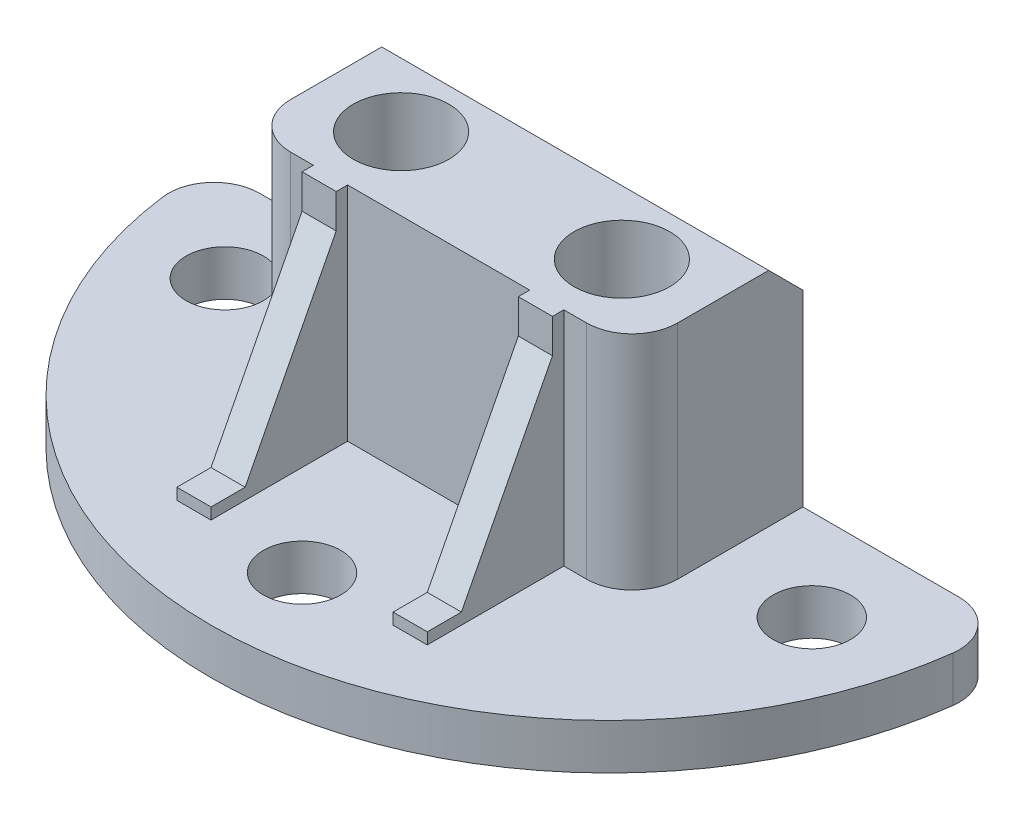
ISO-10303-21;
HEADER;
FILE_DESCRIPTION(('STEP AP214'),'2;1');
FILE_NAME('part.step','',(''),(''),'','','');
FILE_SCHEMA(('AUTOMOTIVE_DESIGN { 1 0 10303 214 1 1 1 1 }'));
ENDSEC;
DATA;
#1=APPLICATION_CONTEXT('core data for automotive mechanical design processes');
#2=APPLICATION_PROTOCOL_DEFINITION('international standard','automotive_design',2000,#1);
#3=PRODUCT_CONTEXT('',#1,'mechanical');
#4=PRODUCT('Part','Part','',(#3));
#5=PRODUCT_RELATED_PRODUCT_CATEGORY('part','',(#4));
#6=PRODUCT_DEFINITION_FORMATION('','',#4);
#7=PRODUCT_DEFINITION_CONTEXT('part definition',#1,'design');
#8=PRODUCT_DEFINITION('design','',#6,#7);
#9=PRODUCT_DEFINITION_SHAPE('','',#8);
#10=(LENGTH_UNIT() NAMED_UNIT(*) SI_UNIT(.MILLI.,.METRE.));
#11=(NAMED_UNIT(*) PLANE_ANGLE_UNIT() SI_UNIT($,.RADIAN.));
#12=(NAMED_UNIT(*) SI_UNIT($,.STERADIAN.) SOLID_ANGLE_UNIT());
#13=UNCERTAINTY_MEASURE_WITH_UNIT(LENGTH_MEASURE(1.E-05),#10,'distance_accuracy_value','');
#14=(GEOMETRIC_REPRESENTATION_CONTEXT(3) GLOBAL_UNCERTAINTY_ASSIGNED_CONTEXT((#13)) GLOBAL_UNIT_ASSIGNED_CONTEXT((#10,
#11,#12)) REPRESENTATION_CONTEXT('',''));
#15=CARTESIAN_POINT('',(0.,0.,0.));
#16=DIRECTION('',(0.,0.,1.));
#17=DIRECTION('',(1.,0.,0.));
#18=AXIS2_PLACEMENT_3D('',#15,#16,#17);
#19=CARTESIAN_POINT('',(0.,11.75,0.));
#20=DIRECTION('',(0.,1.,0.));
#21=DIRECTION('',(0.,0.,1.));
#22=AXIS2_PLACEMENT_3D('',#19,#20,#21);
#23=PLANE('',#22);
#24=CARTESIAN_POINT('',(-4.85,11.75,4.3));
#25=DIRECTION('',(0.,1.,0.));
#26=DIRECTION('',(0.,0.,1.));
#27=AXIS2_PLACEMENT_3D('',#24,#25,#26);
#28=CIRCLE('',#27,2.1);
#29=CARTESIAN_POINT('',(-4.85,11.75,6.4));
#30=VERTEX_POINT('',#29);
#31=EDGE_CURVE('E875',#30,#30,#28,.T.);
#32=ORIENTED_EDGE('',*,*,#31,.F.);
#33=EDGE_LOOP('',(#32));
#34=FACE_BOUND('',#33,.T.);
#35=CARTESIAN_POINT('',(4.85,11.75,4.3));
#36=DIRECTION('',(0.,1.,0.));
#37=DIRECTION('',(0.,0.,1.));
#38=AXIS2_PLACEMENT_3D('',#35,#36,#37);
#39=CIRCLE('',#38,2.1);
#40=CARTESIAN_POINT('',(4.85,11.75,6.4));
#41=VERTEX_POINT('',#40);
#42=EDGE_CURVE('E878',#41,#41,#39,.T.);
#43=ORIENTED_EDGE('',*,*,#42,.F.);
#44=EDGE_LOOP('',(#43));
#45=FACE_BOUND('',#44,.T.);
#46=DIRECTION('',(0.,0.,-1.));
#47=VECTOR('',#46,1.);
#48=CARTESIAN_POINT('',(-5.5,11.75,13.5));
#49=LINE('',#48,#47);
#50=CARTESIAN_POINT('',(-5.5,11.75,8.));
#51=VERTEX_POINT('',#50);
#52=CARTESIAN_POINT('',(-5.5,11.75,7.5));
#53=VERTEX_POINT('',#52);
#54=EDGE_CURVE('E286',#51,#53,#49,.T.);
#55=ORIENTED_EDGE('',*,*,#54,.F.);
#56=DIRECTION('',(1.,0.,0.));
#57=VECTOR('',#56,1.);
#58=CARTESIAN_POINT('',(-17.3704261489394,11.75,8.));
#59=LINE('',#58,#57);
#60=CARTESIAN_POINT('',(-4.,11.75,8.));
#61=VERTEX_POINT('',#60);
#62=EDGE_CURVE('E235',#51,#61,#59,.T.);
#63=ORIENTED_EDGE('',*,*,#62,.T.);
#64=DIRECTION('',(0.,0.,-1.));
#65=VECTOR('',#64,1.);
#66=CARTESIAN_POINT('',(-4.,11.75,13.5));
#67=LINE('',#66,#65);
#68=CARTESIAN_POINT('',(-4.,11.75,7.5));
#69=VERTEX_POINT('',#68);
#70=EDGE_CURVE('E291',#61,#69,#67,.T.);
#71=ORIENTED_EDGE('',*,*,#70,.T.);
#72=DIRECTION('',(1.,0.,0.));
#73=VECTOR('',#72,1.);
#74=CARTESIAN_POINT('',(0.,11.75,7.5));
#75=LINE('',#74,#73);
#76=CARTESIAN_POINT('',(4.,11.75,7.5));
#77=VERTEX_POINT('',#76);
#78=EDGE_CURVE('E307',#69,#77,#75,.T.);
#79=ORIENTED_EDGE('',*,*,#78,.T.);
#80=DIRECTION('',(0.,0.,-1.));
#81=VECTOR('',#80,1.);
#82=CARTESIAN_POINT('',(4.,11.75,13.5));
#83=LINE('',#82,#81);
#84=CARTESIAN_POINT('',(4.,11.75,8.));
#85=VERTEX_POINT('',#84);
#86=EDGE_CURVE('E264',#85,#77,#83,.T.);
#87=ORIENTED_EDGE('',*,*,#86,.F.);
#88=CARTESIAN_POINT('',(5.5,11.75,8.));
#89=VERTEX_POINT('',#88);
#90=EDGE_CURVE('E236',#85,#89,#59,.T.);
#91=ORIENTED_EDGE('',*,*,#90,.T.);
#92=DIRECTION('',(0.,0.,-1.));
#93=VECTOR('',#92,1.);
#94=CARTESIAN_POINT('',(5.5,11.75,13.5));
#95=LINE('',#94,#93);
#96=CARTESIAN_POINT('',(5.5,11.75,7.5));
#97=VERTEX_POINT('',#96);
#98=EDGE_CURVE('E262',#89,#97,#95,.T.);
#99=ORIENTED_EDGE('',*,*,#98,.T.);
#100=CARTESIAN_POINT('',(6.5,11.75,7.5));
#101=VERTEX_POINT('',#100);
#102=EDGE_CURVE('E302',#97,#101,#75,.T.);
#103=ORIENTED_EDGE('',*,*,#102,.T.);
#104=CARTESIAN_POINT('',(6.5,11.75,5.5));
#105=DIRECTION('',(0.,1.,0.));
#106=DIRECTION('',(0.,0.,1.));
#107=AXIS2_PLACEMENT_3D('',#104,#105,#106);
#108=CIRCLE('',#107,2.);
#109=CARTESIAN_POINT('',(8.5,11.75,5.5));
#110=VERTEX_POINT('',#109);
#111=EDGE_CURVE('E380',#101,#110,#108,.T.);
#112=ORIENTED_EDGE('',*,*,#111,.T.);
#113=DIRECTION('',(0.,0.,1.));
#114=VECTOR('',#113,1.);
#115=CARTESIAN_POINT('',(8.5,11.75,0.));
#116=LINE('',#115,#114);
#117=CARTESIAN_POINT('',(8.5,11.75,1.5));
#118=VERTEX_POINT('',#117);
#119=EDGE_CURVE('E298',#118,#110,#116,.T.);
#120=ORIENTED_EDGE('',*,*,#119,.F.);
#121=DIRECTION('',(-1.,0.,0.));
#122=VECTOR('',#121,1.);
#123=CARTESIAN_POINT('',(0.,11.75,1.5));
#124=LINE('',#123,#122);
#125=CARTESIAN_POINT('',(-8.5,11.75,1.5));
#126=VERTEX_POINT('',#125);
#127=EDGE_CURVE('E398',#118,#126,#124,.T.);
#128=ORIENTED_EDGE('',*,*,#127,.T.);
#129=DIRECTION('',(0.,0.,1.));
#130=VECTOR('',#129,1.);
#131=CARTESIAN_POINT('',(-8.5,11.75,0.));
#132=LINE('',#131,#130);
#133=CARTESIAN_POINT('',(-8.5,11.75,5.5));
#134=VERTEX_POINT('',#133);
#135=EDGE_CURVE('E300',#126,#134,#132,.T.);
#136=ORIENTED_EDGE('',*,*,#135,.T.);
#137=CARTESIAN_POINT('',(-6.5,11.75,5.5));
#138=DIRECTION('',(0.,1.,0.));
#139=DIRECTION('',(0.,0.,1.));
#140=AXIS2_PLACEMENT_3D('',#137,#138,#139);
#141=CIRCLE('',#140,2.);
#142=CARTESIAN_POINT('',(-6.5,11.75,7.5));
#143=VERTEX_POINT('',#142);
#144=EDGE_CURVE('E383',#134,#143,#141,.T.);
#145=ORIENTED_EDGE('',*,*,#144,.T.);
#146=EDGE_CURVE('E303',#143,#53,#75,.T.);
#147=ORIENTED_EDGE('',*,*,#146,.T.);
#148=EDGE_LOOP('',(#55,#63,#71,#79,#87,#91,#99,#103,#112,#120,#128,#136,#145,#147));
#149=FACE_BOUND('',#148,.T.);
#150=ADVANCED_FACE('F39',(#34,#45,#149),#23,.T.);
#151=CARTESIAN_POINT('',(-5.5,11.75,13.5));
#152=DIRECTION('',(1.,0.,0.));
#153=DIRECTION('',(0.,1.,0.));
#154=AXIS2_PLACEMENT_3D('',#151,#152,#153);
#155=PLANE('',#154);
#156=DIRECTION('',(0.,0.,1.));
#157=VECTOR('',#156,1.);
#158=CARTESIAN_POINT('',(-5.5,2.5,13.5));
#159=LINE('',#158,#157);
#160=CARTESIAN_POINT('',(-5.5,2.5,12.));
#161=VERTEX_POINT('',#160);
#162=CARTESIAN_POINT('',(-5.5,2.5,13.5));
#163=VERTEX_POINT('',#162);
#164=EDGE_CURVE('E55',#161,#163,#159,.T.);
#165=ORIENTED_EDGE('',*,*,#164,.F.);
#166=DIRECTION('',(0.,-0.888620657054864,0.458642919770252));
#167=VECTOR('',#166,1.);
#168=CARTESIAN_POINT('',(-5.5,9.19289235825801,8.5456039441249));
#169=LINE('',#168,#167);
#170=CARTESIAN_POINT('',(-5.5,10.25,8.));
#171=VERTEX_POINT('',#170);
#172=EDGE_CURVE('E249',#171,#161,#169,.T.);
#173=ORIENTED_EDGE('',*,*,#172,.F.);
#174=DIRECTION('',(0.,-1.,0.));
#175=VECTOR('',#174,1.);
#176=CARTESIAN_POINT('',(-5.5,11.75,8.));
#177=LINE('',#176,#175);
#178=EDGE_CURVE('E255',#51,#171,#177,.T.);
#179=ORIENTED_EDGE('',*,*,#178,.F.);
#180=ORIENTED_EDGE('',*,*,#54,.T.);
#181=DIRECTION('',(0.,-1.,0.));
#182=VECTOR('',#181,1.);
#183=CARTESIAN_POINT('',(-5.5,11.75,7.5));
#184=LINE('',#183,#182);
#185=CARTESIAN_POINT('',(-5.5,2.,7.5));
#186=VERTEX_POINT('',#185);
#187=EDGE_CURVE('E273',#53,#186,#184,.T.);
#188=ORIENTED_EDGE('',*,*,#187,.T.);
#189=DIRECTION('',(0.,0.,-1.));
#190=VECTOR('',#189,1.);
#191=CARTESIAN_POINT('',(-5.5,2.,13.5));
#192=LINE('',#191,#190);
#193=CARTESIAN_POINT('',(-5.5,2.,13.5));
#194=VERTEX_POINT('',#193);
#195=EDGE_CURVE('E295',#194,#186,#192,.T.);
#196=ORIENTED_EDGE('',*,*,#195,.F.);
#197=DIRECTION('',(0.,-1.,0.));
#198=VECTOR('',#197,1.);
#199=CARTESIAN_POINT('',(-5.5,11.75,13.5));
#200=LINE('',#199,#198);
#201=EDGE_CURVE('E278',#163,#194,#200,.T.);
#202=ORIENTED_EDGE('',*,*,#201,.F.);
#203=EDGE_LOOP('',(#165,#173,#179,#180,#188,#196,#202));
#204=FACE_BOUND('',#203,.T.);
#205=ADVANCED_FACE('F460',(#204),#155,.F.);
#206=CARTESIAN_POINT('',(-4.,11.75,13.5));
#207=DIRECTION('',(-1.,0.,0.));
#208=DIRECTION('',(0.,-1.,0.));
#209=AXIS2_PLACEMENT_3D('',#206,#207,#208);
#210=PLANE('',#209);
#211=DIRECTION('',(0.,0.,-1.));
#212=VECTOR('',#211,1.);
#213=CARTESIAN_POINT('',(-4.,2.5,13.5));
#214=LINE('',#213,#212);
#215=CARTESIAN_POINT('',(-4.,2.5,13.5));
#216=VERTEX_POINT('',#215);
#217=CARTESIAN_POINT('',(-4.,2.5,12.));
#218=VERTEX_POINT('',#217);
#219=EDGE_CURVE('E243',#216,#218,#214,.T.);
#220=ORIENTED_EDGE('',*,*,#219,.F.);
#221=DIRECTION('',(0.,1.,0.));
#222=VECTOR('',#221,1.);
#223=CARTESIAN_POINT('',(-4.,11.75,13.5));
#224=LINE('',#223,#222);
#225=CARTESIAN_POINT('',(-4.,2.,13.5));
#226=VERTEX_POINT('',#225);
#227=EDGE_CURVE('E283',#226,#216,#224,.T.);
#228=ORIENTED_EDGE('',*,*,#227,.F.);
#229=DIRECTION('',(0.,0.,-1.));
#230=VECTOR('',#229,1.);
#231=CARTESIAN_POINT('',(-4.,2.,13.5));
#232=LINE('',#231,#230);
#233=CARTESIAN_POINT('',(-4.,2.,7.5));
#234=VERTEX_POINT('',#233);
#235=EDGE_CURVE('E293',#226,#234,#232,.T.);
#236=ORIENTED_EDGE('',*,*,#235,.T.);
#237=DIRECTION('',(0.,1.,0.));
#238=VECTOR('',#237,1.);
#239=CARTESIAN_POINT('',(-4.,11.75,7.5));
#240=LINE('',#239,#238);
#241=EDGE_CURVE('E281',#234,#69,#240,.T.);
#242=ORIENTED_EDGE('',*,*,#241,.T.);
#243=ORIENTED_EDGE('',*,*,#70,.F.);
#244=DIRECTION('',(0.,1.,0.));
#245=VECTOR('',#244,1.);
#246=CARTESIAN_POINT('',(-4.,11.75,8.));
#247=LINE('',#246,#245);
#248=CARTESIAN_POINT('',(-4.,10.25,8.));
#249=VERTEX_POINT('',#248);
#250=EDGE_CURVE('E253',#249,#61,#247,.T.);
#251=ORIENTED_EDGE('',*,*,#250,.F.);
#252=DIRECTION('',(0.,0.888620657054864,-0.458642919770252));
#253=VECTOR('',#252,1.);
#254=CARTESIAN_POINT('',(-4.,9.19289235825801,8.5456039441249));
#255=LINE('',#254,#253);
#256=EDGE_CURVE('E247',#218,#249,#255,.T.);
#257=ORIENTED_EDGE('',*,*,#256,.F.);
#258=EDGE_LOOP('',(#220,#228,#236,#242,#243,#251,#257));
#259=FACE_BOUND('',#258,.T.);
#260=ADVANCED_FACE('F471',(#259),#210,.F.);
#261=CARTESIAN_POINT('',(0.,0.,13.5));
#262=DIRECTION('',(0.,0.,1.));
#263=DIRECTION('',(1.,0.,0.));
#264=AXIS2_PLACEMENT_3D('',#261,#262,#263);
#265=PLANE('',#264);
#266=ORIENTED_EDGE('',*,*,#227,.T.);
#267=DIRECTION('',(1.,0.,0.));
#268=VECTOR('',#267,1.);
#269=CARTESIAN_POINT('',(-17.3704261489394,2.5,13.5));
#270=LINE('',#269,#268);
#271=EDGE_CURVE('E233',#163,#216,#270,.T.);
#272=ORIENTED_EDGE('',*,*,#271,.F.);
#273=ORIENTED_EDGE('',*,*,#201,.T.);
#274=DIRECTION('',(1.,0.,0.));
#275=VECTOR('',#274,1.);
#276=CARTESIAN_POINT('',(-5.5,2.,13.5));
#277=LINE('',#276,#275);
#278=EDGE_CURVE('E280',#194,#226,#277,.T.);
#279=ORIENTED_EDGE('',*,*,#278,.T.);
#280=EDGE_LOOP('',(#266,#272,#273,#279));
#281=FACE_BOUND('',#280,.T.);
#282=ADVANCED_FACE('F468',(#281),#265,.T.);
#283=CARTESIAN_POINT('',(4.,11.75,13.5));
#284=DIRECTION('',(1.,0.,0.));
#285=DIRECTION('',(0.,1.,0.));
#286=AXIS2_PLACEMENT_3D('',#283,#284,#285);
#287=PLANE('',#286);
#288=DIRECTION('',(0.,0.,1.));
#289=VECTOR('',#288,1.);
#290=CARTESIAN_POINT('',(4.,2.5,13.5));
#291=LINE('',#290,#289);
#292=CARTESIAN_POINT('',(4.,2.5,12.));
#293=VERTEX_POINT('',#292);
#294=CARTESIAN_POINT('',(4.,2.5,13.5));
#295=VERTEX_POINT('',#294);
#296=EDGE_CURVE('E63',#293,#295,#291,.T.);
#297=ORIENTED_EDGE('',*,*,#296,.F.);
#298=DIRECTION('',(0.,-0.888620657054864,0.458642919770252));
#299=VECTOR('',#298,1.);
#300=CARTESIAN_POINT('',(4.,9.19289235825801,8.5456039441249));
#301=LINE('',#300,#299);
#302=CARTESIAN_POINT('',(4.,10.25,8.));
#303=VERTEX_POINT('',#302);
#304=EDGE_CURVE('E215',#303,#293,#301,.T.);
#305=ORIENTED_EDGE('',*,*,#304,.F.);
#306=DIRECTION('',(0.,-1.,0.));
#307=VECTOR('',#306,1.);
#308=CARTESIAN_POINT('',(4.,11.75,8.));
#309=LINE('',#308,#307);
#310=EDGE_CURVE('E251',#85,#303,#309,.T.);
#311=ORIENTED_EDGE('',*,*,#310,.F.);
#312=ORIENTED_EDGE('',*,*,#86,.T.);
#313=DIRECTION('',(0.,-1.,0.));
#314=VECTOR('',#313,1.);
#315=CARTESIAN_POINT('',(4.,11.75,7.5));
#316=LINE('',#315,#314);
#317=CARTESIAN_POINT('',(4.,2.,7.5));
#318=VERTEX_POINT('',#317);
#319=EDGE_CURVE('E270',#77,#318,#316,.T.);
#320=ORIENTED_EDGE('',*,*,#319,.T.);
#321=DIRECTION('',(0.,0.,-1.));
#322=VECTOR('',#321,1.);
#323=CARTESIAN_POINT('',(4.,2.,13.5));
#324=LINE('',#323,#322);
#325=CARTESIAN_POINT('',(4.,2.,13.5));
#326=VERTEX_POINT('',#325);
#327=EDGE_CURVE('E257',#326,#318,#324,.T.);
#328=ORIENTED_EDGE('',*,*,#327,.F.);
#329=DIRECTION('',(0.,-1.,0.));
#330=VECTOR('',#329,1.);
#331=CARTESIAN_POINT('',(4.,11.75,13.5));
#332=LINE('',#331,#330);
#333=EDGE_CURVE('E271',#295,#326,#332,.T.);
#334=ORIENTED_EDGE('',*,*,#333,.F.);
#335=EDGE_LOOP('',(#297,#305,#311,#312,#320,#328,#334));
#336=FACE_BOUND('',#335,.T.);
#337=ADVANCED_FACE('F494',(#336),#287,.F.);
#338=CARTESIAN_POINT('',(5.5,11.75,13.5));
#339=DIRECTION('',(-1.,0.,0.));
#340=DIRECTION('',(0.,-1.,0.));
#341=AXIS2_PLACEMENT_3D('',#338,#339,#340);
#342=PLANE('',#341);
#343=DIRECTION('',(0.,0.,1.));
#344=VECTOR('',#343,1.);
#345=CARTESIAN_POINT('',(5.5,2.50000000000001,0.));
#346=LINE('',#345,#344);
#347=CARTESIAN_POINT('',(5.5,2.5,12.));
#348=VERTEX_POINT('',#347);
#349=CARTESIAN_POINT('',(5.5,2.5,13.5));
#350=VERTEX_POINT('',#349);
#351=EDGE_CURVE('E220',#348,#350,#346,.T.);
#352=ORIENTED_EDGE('',*,*,#351,.T.);
#353=DIRECTION('',(0.,1.,0.));
#354=VECTOR('',#353,1.);
#355=CARTESIAN_POINT('',(5.5,11.75,13.5));
#356=LINE('',#355,#354);
#357=CARTESIAN_POINT('',(5.5,2.,13.5));
#358=VERTEX_POINT('',#357);
#359=EDGE_CURVE('E266',#358,#350,#356,.T.);
#360=ORIENTED_EDGE('',*,*,#359,.F.);
#361=DIRECTION('',(0.,0.,-1.));
#362=VECTOR('',#361,1.);
#363=CARTESIAN_POINT('',(5.5,2.,13.5));
#364=LINE('',#363,#362);
#365=CARTESIAN_POINT('',(5.5,2.,7.5));
#366=VERTEX_POINT('',#365);
#367=EDGE_CURVE('E260',#358,#366,#364,.T.);
#368=ORIENTED_EDGE('',*,*,#367,.T.);
#369=DIRECTION('',(0.,1.,0.));
#370=VECTOR('',#369,1.);
#371=CARTESIAN_POINT('',(5.5,11.75,7.5));
#372=LINE('',#371,#370);
#373=EDGE_CURVE('E267',#366,#97,#372,.T.);
#374=ORIENTED_EDGE('',*,*,#373,.T.);
#375=ORIENTED_EDGE('',*,*,#98,.F.);
#376=DIRECTION('',(0.,-1.,0.));
#377=VECTOR('',#376,1.);
#378=CARTESIAN_POINT('',(5.5,0.,8.));
#379=LINE('',#378,#377);
#380=CARTESIAN_POINT('',(5.5,10.25,8.));
#381=VERTEX_POINT('',#380);
#382=EDGE_CURVE('E217',#89,#381,#379,.T.);
#383=ORIENTED_EDGE('',*,*,#382,.T.);
#384=DIRECTION('',(0.,-0.888620657054864,0.458642919770252));
#385=VECTOR('',#384,1.);
#386=CARTESIAN_POINT('',(5.5,5.41659819227609,10.4946589975349));
#387=LINE('',#386,#385);
#388=EDGE_CURVE('E212',#381,#348,#387,.T.);
#389=ORIENTED_EDGE('',*,*,#388,.T.);
#390=EDGE_LOOP('',(#352,#360,#368,#374,#375,#383,#389));
#391=FACE_BOUND('',#390,.T.);
#392=ADVANCED_FACE('F227',(#391),#342,.F.);
#393=CARTESIAN_POINT('',(0.,0.,13.5));
#394=DIRECTION('',(0.,0.,1.));
#395=DIRECTION('',(1.,0.,0.));
#396=AXIS2_PLACEMENT_3D('',#393,#394,#395);
#397=PLANE('',#396);
#398=ORIENTED_EDGE('',*,*,#359,.T.);
#399=DIRECTION('',(-1.,0.,0.));
#400=VECTOR('',#399,1.);
#401=CARTESIAN_POINT('',(0.,2.5,13.5));
#402=LINE('',#401,#400);
#403=EDGE_CURVE('E11',#350,#295,#402,.T.);
#404=ORIENTED_EDGE('',*,*,#403,.T.);
#405=ORIENTED_EDGE('',*,*,#333,.T.);
#406=DIRECTION('',(1.,0.,0.));
#407=VECTOR('',#406,1.);
#408=CARTESIAN_POINT('',(4.,2.,13.5));
#409=LINE('',#408,#407);
#410=EDGE_CURVE('E275',#326,#358,#409,.T.);
#411=ORIENTED_EDGE('',*,*,#410,.T.);
#412=EDGE_LOOP('',(#398,#404,#405,#411));
#413=FACE_BOUND('',#412,.T.);
#414=ADVANCED_FACE('F527',(#413),#397,.T.);
#415=CARTESIAN_POINT('',(0.,2.,0.));
#416=DIRECTION('',(0.,1.,0.));
#417=DIRECTION('',(0.,0.,1.));
#418=AXIS2_PLACEMENT_3D('',#415,#416,#417);
#419=PLANE('',#418);
#420=CARTESIAN_POINT('',(12.8937969582276,2.,4.));
#421=DIRECTION('',(0.,1.,0.));
#422=DIRECTION('',(0.,0.,1.));
#423=AXIS2_PLACEMENT_3D('',#420,#421,#422);
#424=CIRCLE('',#423,1.7);
#425=CARTESIAN_POINT('',(12.8937969582276,2.,5.7));
#426=VERTEX_POINT('',#425);
#427=EDGE_CURVE('E312',#426,#426,#424,.T.);
#428=ORIENTED_EDGE('',*,*,#427,.F.);
#429=EDGE_LOOP('',(#428));
#430=FACE_BOUND('',#429,.T.);
#431=CARTESIAN_POINT('',(-12.8937969582276,2.,4.));
#432=DIRECTION('',(0.,1.,0.));
#433=DIRECTION('',(0.,0.,1.));
#434=AXIS2_PLACEMENT_3D('',#431,#432,#433);
#435=CIRCLE('',#434,1.7);
#436=CARTESIAN_POINT('',(-12.8937969582276,2.,5.7));
#437=VERTEX_POINT('',#436);
#438=EDGE_CURVE('E334',#437,#437,#435,.T.);
#439=ORIENTED_EDGE('',*,*,#438,.F.);
#440=EDGE_LOOP('',(#439));
#441=FACE_BOUND('',#440,.T.);
#442=CARTESIAN_POINT('',(0.,2.,13.5));
#443=DIRECTION('',(0.,1.,0.));
#444=DIRECTION('',(0.,0.,1.));
#445=AXIS2_PLACEMENT_3D('',#442,#443,#444);
#446=CIRCLE('',#445,1.7);
#447=CARTESIAN_POINT('',(0.,2.,15.2));
#448=VERTEX_POINT('',#447);
#449=EDGE_CURVE('E337',#448,#448,#446,.T.);
#450=ORIENTED_EDGE('',*,*,#449,.F.);
#451=EDGE_LOOP('',(#450));
#452=FACE_BOUND('',#451,.T.);
#453=ORIENTED_EDGE('',*,*,#410,.F.);
#454=ORIENTED_EDGE('',*,*,#327,.T.);
#455=DIRECTION('',(1.,0.,0.));
#456=VECTOR('',#455,1.);
#457=CARTESIAN_POINT('',(0.,2.,7.5));
#458=LINE('',#457,#456);
#459=EDGE_CURVE('E331',#234,#318,#458,.T.);
#460=ORIENTED_EDGE('',*,*,#459,.F.);
#461=ORIENTED_EDGE('',*,*,#235,.F.);
#462=ORIENTED_EDGE('',*,*,#278,.F.);
#463=ORIENTED_EDGE('',*,*,#195,.T.);
#464=CARTESIAN_POINT('',(-6.5,2.,7.5));
#465=VERTEX_POINT('',#464);
#466=EDGE_CURVE('E327',#465,#186,#458,.T.);
#467=ORIENTED_EDGE('',*,*,#466,.F.);
#468=CARTESIAN_POINT('',(-6.5,2.,5.5));
#469=DIRECTION('',(0.,1.,0.));
#470=DIRECTION('',(0.,0.,1.));
#471=AXIS2_PLACEMENT_3D('',#468,#469,#470);
#472=CIRCLE('',#471,2.);
#473=CARTESIAN_POINT('',(-8.5,2.,5.5));
#474=VERTEX_POINT('',#473);
#475=EDGE_CURVE('E388',#465,#474,#472,.F.);
#476=ORIENTED_EDGE('',*,*,#475,.T.);
#477=DIRECTION('',(0.,0.,1.));
#478=VECTOR('',#477,1.);
#479=CARTESIAN_POINT('',(-8.5,2.,0.));
#480=LINE('',#479,#478);
#481=CARTESIAN_POINT('',(-8.5,2.,0.));
#482=VERTEX_POINT('',#481);
#483=EDGE_CURVE('E330',#482,#474,#480,.T.);
#484=ORIENTED_EDGE('',*,*,#483,.F.);
#485=DIRECTION('',(1.,0.,0.));
#486=VECTOR('',#485,1.);
#487=CARTESIAN_POINT('',(0.,2.,0.));
#488=LINE('',#487,#486);
#489=CARTESIAN_POINT('',(-15.3704261489394,2.,0.));
#490=VERTEX_POINT('',#489);
#491=EDGE_CURVE('E323',#490,#482,#488,.T.);
#492=ORIENTED_EDGE('',*,*,#491,.F.);
#493=CARTESIAN_POINT('',(-15.3704261489394,2.,2.));
#494=DIRECTION('',(0.,1.,0.));
#495=DIRECTION('',(0.,0.,1.));
#496=AXIS2_PLACEMENT_3D('',#493,#494,#495);
#497=CIRCLE('',#496,2.);
#498=CARTESIAN_POINT('',(-17.3537069423509,2.,2.25806451612903));
#499=VERTEX_POINT('',#498);
#500=EDGE_CURVE('E369',#490,#499,#497,.T.);
#501=ORIENTED_EDGE('',*,*,#500,.T.);
#502=CARTESIAN_POINT('',(0.,2.,0.));
#503=DIRECTION('',(0.,1.,0.));
#504=DIRECTION('',(0.,0.,1.));
#505=AXIS2_PLACEMENT_3D('',#502,#503,#504);
#506=CIRCLE('',#505,17.5);
#507=CARTESIAN_POINT('',(17.3537069423509,2.,2.25806451612903));
#508=VERTEX_POINT('',#507);
#509=EDGE_CURVE('E315',#499,#508,#506,.T.);
#510=ORIENTED_EDGE('',*,*,#509,.T.);
#511=CARTESIAN_POINT('',(15.3704261489394,2.,1.99999999999999));
#512=DIRECTION('',(0.,1.,0.));
#513=DIRECTION('',(0.,0.,1.));
#514=AXIS2_PLACEMENT_3D('',#511,#512,#513);
#515=CIRCLE('',#514,2.);
#516=CARTESIAN_POINT('',(15.3704261489394,2.,0.));
#517=VERTEX_POINT('',#516);
#518=EDGE_CURVE('E367',#508,#517,#515,.T.);
#519=ORIENTED_EDGE('',*,*,#518,.T.);
#520=CARTESIAN_POINT('',(8.5,2.,0.));
#521=VERTEX_POINT('',#520);
#522=EDGE_CURVE('E319',#521,#517,#488,.T.);
#523=ORIENTED_EDGE('',*,*,#522,.F.);
#524=DIRECTION('',(0.,0.,1.));
#525=VECTOR('',#524,1.);
#526=CARTESIAN_POINT('',(8.5,2.,0.));
#527=LINE('',#526,#525);
#528=CARTESIAN_POINT('',(8.5,2.,5.5));
#529=VERTEX_POINT('',#528);
#530=EDGE_CURVE('E322',#521,#529,#527,.T.);
#531=ORIENTED_EDGE('',*,*,#530,.T.);
#532=CARTESIAN_POINT('',(6.5,2.,5.5));
#533=DIRECTION('',(0.,1.,0.));
#534=DIRECTION('',(0.,0.,1.));
#535=AXIS2_PLACEMENT_3D('',#532,#533,#534);
#536=CIRCLE('',#535,2.);
#537=CARTESIAN_POINT('',(6.5,2.,7.5));
#538=VERTEX_POINT('',#537);
#539=EDGE_CURVE('E390',#529,#538,#536,.F.);
#540=ORIENTED_EDGE('',*,*,#539,.T.);
#541=EDGE_CURVE('E326',#366,#538,#458,.T.);
#542=ORIENTED_EDGE('',*,*,#541,.F.);
#543=ORIENTED_EDGE('',*,*,#367,.F.);
#544=EDGE_LOOP('',(#453,#454,#460,#461,#462,#463,#467,#476,#484,#492,#501,#510,#519,#523,#531,
#540,#542,#543));
#545=FACE_BOUND('',#544,.T.);
#546=ADVANCED_FACE('F428',(#430,#441,#452,#545),#419,.T.);
#547=CARTESIAN_POINT('',(0.,11.75,7.5));
#548=DIRECTION('',(0.,0.,-1.));
#549=DIRECTION('',(-1.,0.,0.));
#550=AXIS2_PLACEMENT_3D('',#547,#548,#549);
#551=PLANE('',#550);
#552=ORIENTED_EDGE('',*,*,#319,.F.);
#553=ORIENTED_EDGE('',*,*,#78,.F.);
#554=ORIENTED_EDGE('',*,*,#241,.F.);
#555=ORIENTED_EDGE('',*,*,#459,.T.);
#556=EDGE_LOOP('',(#552,#553,#554,#555));
#557=FACE_BOUND('',#556,.T.);
#558=ADVANCED_FACE('F490',(#557),#551,.F.);
#559=ORIENTED_EDGE('',*,*,#373,.F.);
#560=ORIENTED_EDGE('',*,*,#541,.T.);
#561=DIRECTION('',(0.,-1.,0.));
#562=VECTOR('',#561,1.);
#563=CARTESIAN_POINT('',(6.5,11.75,7.5));
#564=LINE('',#563,#562);
#565=EDGE_CURVE('E371',#538,#101,#564,.F.);
#566=ORIENTED_EDGE('',*,*,#565,.T.);
#567=ORIENTED_EDGE('',*,*,#102,.F.);
#568=EDGE_LOOP('',(#559,#560,#566,#567));
#569=FACE_BOUND('',#568,.T.);
#570=ADVANCED_FACE('F520',(#569),#551,.F.);
#571=ORIENTED_EDGE('',*,*,#187,.F.);
#572=ORIENTED_EDGE('',*,*,#146,.F.);
#573=DIRECTION('',(0.,-1.,0.));
#574=VECTOR('',#573,1.);
#575=CARTESIAN_POINT('',(-6.5,11.75,7.5));
#576=LINE('',#575,#574);
#577=EDGE_CURVE('E374',#143,#465,#576,.T.);
#578=ORIENTED_EDGE('',*,*,#577,.T.);
#579=ORIENTED_EDGE('',*,*,#466,.T.);
#580=EDGE_LOOP('',(#571,#572,#578,#579));
#581=FACE_BOUND('',#580,.T.);
#582=ADVANCED_FACE('F457',(#581),#551,.F.);
#583=CARTESIAN_POINT('',(0.,2.,0.));
#584=DIRECTION('',(0.,-1.,0.));
#585=DIRECTION('',(0.,0.,-1.));
#586=AXIS2_PLACEMENT_3D('',#583,#584,#585);
#587=CYLINDRICAL_SURFACE('',#586,17.5);
#588=ORIENTED_EDGE('',*,*,#509,.F.);
#589=DIRECTION('',(0.,-1.,0.));
#590=VECTOR('',#589,1.);
#591=CARTESIAN_POINT('',(-17.3537069423509,2.,2.25806451612903));
#592=LINE('',#591,#590);
#593=CARTESIAN_POINT('',(-17.3537069423509,0.,2.25806451612903));
#594=VERTEX_POINT('',#593);
#595=EDGE_CURVE('E355',#499,#594,#592,.T.);
#596=ORIENTED_EDGE('',*,*,#595,.T.);
#597=CARTESIAN_POINT('',(0.,0.,0.));
#598=DIRECTION('',(0.,1.,0.));
#599=DIRECTION('',(0.,0.,1.));
#600=AXIS2_PLACEMENT_3D('',#597,#598,#599);
#601=CIRCLE('',#600,17.5);
#602=CARTESIAN_POINT('',(17.3537069423509,0.,2.25806451612903));
#603=VERTEX_POINT('',#602);
#604=EDGE_CURVE('E343',#594,#603,#601,.T.);
#605=ORIENTED_EDGE('',*,*,#604,.T.);
#606=DIRECTION('',(0.,-1.,0.));
#607=VECTOR('',#606,1.);
#608=CARTESIAN_POINT('',(17.3537069423509,2.,2.25806451612903));
#609=LINE('',#608,#607);
#610=EDGE_CURVE('E340',#603,#508,#609,.F.);
#611=ORIENTED_EDGE('',*,*,#610,.T.);
#612=EDGE_LOOP('',(#588,#596,#605,#611));
#613=FACE_BOUND('',#612,.T.);
#614=ADVANCED_FACE('F442',(#613),#587,.T.);
#615=CARTESIAN_POINT('',(-12.8937969582276,2.,4.));
#616=DIRECTION('',(0.,-1.,0.));
#617=DIRECTION('',(0.,0.,-1.));
#618=AXIS2_PLACEMENT_3D('',#615,#616,#617);
#619=CYLINDRICAL_SURFACE('',#618,1.7);
#620=ORIENTED_EDGE('',*,*,#438,.T.);
#621=EDGE_LOOP('',(#620));
#622=FACE_BOUND('',#621,.T.);
#623=CARTESIAN_POINT('',(-12.8937969582276,0.,4.));
#624=DIRECTION('',(0.,1.,0.));
#625=DIRECTION('',(0.,0.,1.));
#626=AXIS2_PLACEMENT_3D('',#623,#624,#625);
#627=CIRCLE('',#626,1.7);
#628=CARTESIAN_POINT('',(-12.8937969582276,0.,5.7));
#629=VERTEX_POINT('',#628);
#630=EDGE_CURVE('E349',#629,#629,#627,.T.);
#631=ORIENTED_EDGE('',*,*,#630,.F.);
#632=EDGE_LOOP('',(#631));
#633=FACE_BOUND('',#632,.T.);
#634=ADVANCED_FACE('F537',(#622,#633),#619,.F.);
#635=CARTESIAN_POINT('',(0.,2.,0.));
#636=DIRECTION('',(0.,0.,-1.));
#637=DIRECTION('',(-1.,0.,0.));
#638=AXIS2_PLACEMENT_3D('',#635,#636,#637);
#639=PLANE('',#638);
#640=DIRECTION('',(0.,-1.,0.));
#641=VECTOR('',#640,1.);
#642=CARTESIAN_POINT('',(-8.5,11.75,0.));
#643=LINE('',#642,#641);
#644=CARTESIAN_POINT('',(-8.5,10.25,0.));
#645=VERTEX_POINT('',#644);
#646=EDGE_CURVE('E306',#645,#482,#643,.T.);
#647=ORIENTED_EDGE('',*,*,#646,.F.);
#648=DIRECTION('',(1.,0.,0.));
#649=VECTOR('',#648,1.);
#650=CARTESIAN_POINT('',(0.,10.25,0.));
#651=LINE('',#650,#649);
#652=CARTESIAN_POINT('',(8.5,10.25,0.));
#653=VERTEX_POINT('',#652);
#654=EDGE_CURVE('E393',#645,#653,#651,.T.);
#655=ORIENTED_EDGE('',*,*,#654,.T.);
#656=DIRECTION('',(0.,-1.,0.));
#657=VECTOR('',#656,1.);
#658=CARTESIAN_POINT('',(8.5,11.75,0.));
#659=LINE('',#658,#657);
#660=EDGE_CURVE('E309',#653,#521,#659,.T.);
#661=ORIENTED_EDGE('',*,*,#660,.T.);
#662=ORIENTED_EDGE('',*,*,#522,.T.);
#663=DIRECTION('',(0.,1.,0.));
#664=VECTOR('',#663,1.);
#665=CARTESIAN_POINT('',(15.3704261489394,0.,0.));
#666=LINE('',#665,#664);
#667=CARTESIAN_POINT('',(15.3704261489394,0.,0.));
#668=VERTEX_POINT('',#667);
#669=EDGE_CURVE('E362',#517,#668,#666,.F.);
#670=ORIENTED_EDGE('',*,*,#669,.T.);
#671=DIRECTION('',(1.,0.,0.));
#672=VECTOR('',#671,1.);
#673=CARTESIAN_POINT('',(0.,0.,0.));
#674=LINE('',#673,#672);
#675=CARTESIAN_POINT('',(-15.3704261489394,0.,0.));
#676=VERTEX_POINT('',#675);
#677=EDGE_CURVE('E346',#676,#668,#674,.T.);
#678=ORIENTED_EDGE('',*,*,#677,.F.);
#679=DIRECTION('',(0.,1.,0.));
#680=VECTOR('',#679,1.);
#681=CARTESIAN_POINT('',(-15.3704261489394,2.,0.));
#682=LINE('',#681,#680);
#683=EDGE_CURVE('E365',#676,#490,#682,.T.);
#684=ORIENTED_EDGE('',*,*,#683,.T.);
#685=ORIENTED_EDGE('',*,*,#491,.T.);
#686=EDGE_LOOP('',(#647,#655,#661,#662,#670,#678,#684,#685));
#687=FACE_BOUND('',#686,.T.);
#688=ADVANCED_FACE('F409',(#687),#639,.T.);
#689=CARTESIAN_POINT('',(12.8937969582276,2.,4.));
#690=DIRECTION('',(0.,-1.,0.));
#691=DIRECTION('',(0.,0.,-1.));
#692=AXIS2_PLACEMENT_3D('',#689,#690,#691);
#693=CYLINDRICAL_SURFACE('',#692,1.7);
#694=ORIENTED_EDGE('',*,*,#427,.T.);
#695=EDGE_LOOP('',(#694));
#696=FACE_BOUND('',#695,.T.);
#697=CARTESIAN_POINT('',(12.8937969582276,0.,4.));
#698=DIRECTION('',(0.,1.,0.));
#699=DIRECTION('',(0.,0.,1.));
#700=AXIS2_PLACEMENT_3D('',#697,#698,#699);
#701=CIRCLE('',#700,1.7);
#702=CARTESIAN_POINT('',(12.8937969582276,0.,5.7));
#703=VERTEX_POINT('',#702);
#704=EDGE_CURVE('E311',#703,#703,#701,.T.);
#705=ORIENTED_EDGE('',*,*,#704,.F.);
#706=EDGE_LOOP('',(#705));
#707=FACE_BOUND('',#706,.T.);
#708=ADVANCED_FACE('F535',(#696,#707),#693,.F.);
#709=CARTESIAN_POINT('',(0.,2.,13.5));
#710=DIRECTION('',(0.,-1.,0.));
#711=DIRECTION('',(0.,0.,-1.));
#712=AXIS2_PLACEMENT_3D('',#709,#710,#711);
#713=CYLINDRICAL_SURFACE('',#712,1.7);
#714=ORIENTED_EDGE('',*,*,#449,.T.);
#715=EDGE_LOOP('',(#714));
#716=FACE_BOUND('',#715,.T.);
#717=CARTESIAN_POINT('',(0.,0.,13.5));
#718=DIRECTION('',(0.,1.,0.));
#719=DIRECTION('',(0.,0.,1.));
#720=AXIS2_PLACEMENT_3D('',#717,#718,#719);
#721=CIRCLE('',#720,1.7);
#722=CARTESIAN_POINT('',(0.,0.,15.2));
#723=VERTEX_POINT('',#722);
#724=EDGE_CURVE('E316',#723,#723,#721,.T.);
#725=ORIENTED_EDGE('',*,*,#724,.F.);
#726=EDGE_LOOP('',(#725));
#727=FACE_BOUND('',#726,.T.);
#728=ADVANCED_FACE('F531',(#716,#727),#713,.F.);
#729=CARTESIAN_POINT('',(0.,0.,0.));
#730=DIRECTION('',(0.,1.,0.));
#731=DIRECTION('',(0.,0.,1.));
#732=AXIS2_PLACEMENT_3D('',#729,#730,#731);
#733=PLANE('',#732);
#734=ORIENTED_EDGE('',*,*,#704,.T.);
#735=EDGE_LOOP('',(#734));
#736=FACE_BOUND('',#735,.T.);
#737=ORIENTED_EDGE('',*,*,#604,.F.);
#738=CARTESIAN_POINT('',(-15.3704261489394,0.,2.));
#739=DIRECTION('',(0.,1.,0.));
#740=DIRECTION('',(0.,0.,1.));
#741=AXIS2_PLACEMENT_3D('',#738,#739,#740);
#742=CIRCLE('',#741,2.);
#743=EDGE_CURVE('E360',#594,#676,#742,.F.);
#744=ORIENTED_EDGE('',*,*,#743,.T.);
#745=ORIENTED_EDGE('',*,*,#677,.T.);
#746=CARTESIAN_POINT('',(15.3704261489394,0.,1.99999999999999));
#747=DIRECTION('',(0.,1.,0.));
#748=DIRECTION('',(0.,0.,1.));
#749=AXIS2_PLACEMENT_3D('',#746,#747,#748);
#750=CIRCLE('',#749,2.);
#751=EDGE_CURVE('E358',#668,#603,#750,.F.);
#752=ORIENTED_EDGE('',*,*,#751,.T.);
#753=EDGE_LOOP('',(#737,#744,#745,#752));
#754=FACE_BOUND('',#753,.T.);
#755=ORIENTED_EDGE('',*,*,#630,.T.);
#756=EDGE_LOOP('',(#755));
#757=FACE_BOUND('',#756,.T.);
#758=ORIENTED_EDGE('',*,*,#724,.T.);
#759=EDGE_LOOP('',(#758));
#760=FACE_BOUND('',#759,.T.);
#761=ADVANCED_FACE('F438',(#736,#754,#757,#760),#733,.F.);
#762=CARTESIAN_POINT('',(8.5,11.75,0.));
#763=DIRECTION('',(1.,0.,0.));
#764=DIRECTION('',(0.,0.,-1.));
#765=AXIS2_PLACEMENT_3D('',#762,#763,#764);
#766=PLANE('',#765);
#767=ORIENTED_EDGE('',*,*,#660,.F.);
#768=DIRECTION('',(0.,-0.707106781186545,-0.70710678118655));
#769=VECTOR('',#768,1.);
#770=CARTESIAN_POINT('',(8.5,11.,0.749999999999994));
#771=LINE('',#770,#769);
#772=EDGE_CURVE('E396',#653,#118,#771,.F.);
#773=ORIENTED_EDGE('',*,*,#772,.T.);
#774=ORIENTED_EDGE('',*,*,#119,.T.);
#775=DIRECTION('',(0.,-1.,0.));
#776=VECTOR('',#775,1.);
#777=CARTESIAN_POINT('',(8.5,2.,5.5));
#778=LINE('',#777,#776);
#779=EDGE_CURVE('E385',#110,#529,#778,.T.);
#780=ORIENTED_EDGE('',*,*,#779,.T.);
#781=ORIENTED_EDGE('',*,*,#530,.F.);
#782=EDGE_LOOP('',(#767,#773,#774,#780,#781));
#783=FACE_BOUND('',#782,.T.);
#784=ADVANCED_FACE('F415',(#783),#766,.T.);
#785=CARTESIAN_POINT('',(-8.5,11.75,0.));
#786=DIRECTION('',(1.,0.,0.));
#787=DIRECTION('',(0.,0.,-1.));
#788=AXIS2_PLACEMENT_3D('',#785,#786,#787);
#789=PLANE('',#788);
#790=ORIENTED_EDGE('',*,*,#135,.F.);
#791=DIRECTION('',(0.,0.707106781186545,0.70710678118655));
#792=VECTOR('',#791,1.);
#793=CARTESIAN_POINT('',(-8.5,10.25,0.));
#794=LINE('',#793,#792);
#795=EDGE_CURVE('E48',#126,#645,#794,.F.);
#796=ORIENTED_EDGE('',*,*,#795,.T.);
#797=ORIENTED_EDGE('',*,*,#646,.T.);
#798=ORIENTED_EDGE('',*,*,#483,.T.);
#799=DIRECTION('',(0.,-1.,0.));
#800=VECTOR('',#799,1.);
#801=CARTESIAN_POINT('',(-8.5,11.75,5.5));
#802=LINE('',#801,#800);
#803=EDGE_CURVE('E377',#474,#134,#802,.F.);
#804=ORIENTED_EDGE('',*,*,#803,.T.);
#805=EDGE_LOOP('',(#790,#796,#797,#798,#804));
#806=FACE_BOUND('',#805,.T.);
#807=ADVANCED_FACE('F403',(#806),#789,.F.);
#808=CARTESIAN_POINT('',(-15.3704261489394,2.,2.));
#809=DIRECTION('',(0.,-1.,0.));
#810=DIRECTION('',(0.,0.,-1.));
#811=AXIS2_PLACEMENT_3D('',#808,#809,#810);
#812=CYLINDRICAL_SURFACE('',#811,2.);
#813=ORIENTED_EDGE('',*,*,#500,.F.);
#814=ORIENTED_EDGE('',*,*,#683,.F.);
#815=ORIENTED_EDGE('',*,*,#743,.F.);
#816=ORIENTED_EDGE('',*,*,#595,.F.);
#817=EDGE_LOOP('',(#813,#814,#815,#816));
#818=FACE_BOUND('',#817,.T.);
#819=ADVANCED_FACE('F446',(#818),#812,.T.);
#820=CARTESIAN_POINT('',(-6.5,11.75,5.5));
#821=DIRECTION('',(0.,-1.,0.));
#822=DIRECTION('',(0.,0.,-1.));
#823=AXIS2_PLACEMENT_3D('',#820,#821,#822);
#824=CYLINDRICAL_SURFACE('',#823,2.);
#825=ORIENTED_EDGE('',*,*,#144,.F.);
#826=ORIENTED_EDGE('',*,*,#803,.F.);
#827=ORIENTED_EDGE('',*,*,#475,.F.);
#828=ORIENTED_EDGE('',*,*,#577,.F.);
#829=EDGE_LOOP('',(#825,#826,#827,#828));
#830=FACE_BOUND('',#829,.T.);
#831=ADVANCED_FACE('F452',(#830),#824,.T.);
#832=CARTESIAN_POINT('',(6.5,11.75,5.5));
#833=DIRECTION('',(0.,1.,0.));
#834=DIRECTION('',(0.,0.,1.));
#835=AXIS2_PLACEMENT_3D('',#832,#833,#834);
#836=CYLINDRICAL_SURFACE('',#835,2.);
#837=ORIENTED_EDGE('',*,*,#111,.F.);
#838=ORIENTED_EDGE('',*,*,#565,.F.);
#839=ORIENTED_EDGE('',*,*,#539,.F.);
#840=ORIENTED_EDGE('',*,*,#779,.F.);
#841=EDGE_LOOP('',(#837,#838,#839,#840));
#842=FACE_BOUND('',#841,.T.);
#843=ADVANCED_FACE('F424',(#842),#836,.T.);
#844=CARTESIAN_POINT('',(15.3704261489394,2.,1.99999999999999));
#845=DIRECTION('',(0.,-1.,0.));
#846=DIRECTION('',(0.,0.,-1.));
#847=AXIS2_PLACEMENT_3D('',#844,#845,#846);
#848=CYLINDRICAL_SURFACE('',#847,2.);
#849=ORIENTED_EDGE('',*,*,#518,.F.);
#850=ORIENTED_EDGE('',*,*,#610,.F.);
#851=ORIENTED_EDGE('',*,*,#751,.F.);
#852=ORIENTED_EDGE('',*,*,#669,.F.);
#853=EDGE_LOOP('',(#849,#850,#851,#852));
#854=FACE_BOUND('',#853,.T.);
#855=ADVANCED_FACE('F434',(#854),#848,.T.);
#856=CARTESIAN_POINT('',(0.,10.25,0.));
#857=DIRECTION('',(0.,-0.70710678118655,0.707106781186545));
#858=DIRECTION('',(1.,0.,0.));
#859=AXIS2_PLACEMENT_3D('',#856,#857,#858);
#860=PLANE('',#859);
#861=ORIENTED_EDGE('',*,*,#795,.F.);
#862=ORIENTED_EDGE('',*,*,#127,.F.);
#863=ORIENTED_EDGE('',*,*,#772,.F.);
#864=ORIENTED_EDGE('',*,*,#654,.F.);
#865=EDGE_LOOP('',(#861,#862,#863,#864));
#866=FACE_BOUND('',#865,.T.);
#867=ADVANCED_FACE('F42',(#866),#860,.F.);
#868=CARTESIAN_POINT('',(-17.3704261489394,2.5,0.));
#869=DIRECTION('',(0.,1.,0.));
#870=DIRECTION('',(0.,0.,1.));
#871=AXIS2_PLACEMENT_3D('',#868,#869,#870);
#872=PLANE('',#871);
#873=ORIENTED_EDGE('',*,*,#296,.T.);
#874=ORIENTED_EDGE('',*,*,#403,.F.);
#875=ORIENTED_EDGE('',*,*,#351,.F.);
#876=DIRECTION('',(1.,0.,0.));
#877=VECTOR('',#876,1.);
#878=CARTESIAN_POINT('',(-17.3704261489394,2.5,12.));
#879=LINE('',#878,#877);
#880=EDGE_CURVE('E207',#293,#348,#879,.T.);
#881=ORIENTED_EDGE('',*,*,#880,.F.);
#882=EDGE_LOOP('',(#873,#874,#875,#881));
#883=FACE_BOUND('',#882,.T.);
#884=ADVANCED_FACE('F221',(#883),#872,.T.);
#885=CARTESIAN_POINT('',(-17.3704261489394,5.41659819227609,10.4946589975349));
#886=DIRECTION('',(0.,0.458642919770252,0.888620657054864));
#887=DIRECTION('',(0.,-0.888620657054864,0.458642919770252));
#888=AXIS2_PLACEMENT_3D('',#885,#886,#887);
#889=PLANE('',#888);
#890=ORIENTED_EDGE('',*,*,#304,.T.);
#891=ORIENTED_EDGE('',*,*,#880,.T.);
#892=ORIENTED_EDGE('',*,*,#388,.F.);
#893=DIRECTION('',(1.,0.,0.));
#894=VECTOR('',#893,1.);
#895=CARTESIAN_POINT('',(-17.3704261489394,10.25,8.));
#896=LINE('',#895,#894);
#897=EDGE_CURVE('E240',#303,#381,#896,.T.);
#898=ORIENTED_EDGE('',*,*,#897,.F.);
#899=EDGE_LOOP('',(#890,#891,#892,#898));
#900=FACE_BOUND('',#899,.T.);
#901=ADVANCED_FACE('F209',(#900),#889,.T.);
#902=CARTESIAN_POINT('',(-17.3704261489394,0.,8.));
#903=DIRECTION('',(0.,0.,1.));
#904=DIRECTION('',(1.,0.,0.));
#905=AXIS2_PLACEMENT_3D('',#902,#903,#904);
#906=PLANE('',#905);
#907=ORIENTED_EDGE('',*,*,#310,.T.);
#908=ORIENTED_EDGE('',*,*,#897,.T.);
#909=ORIENTED_EDGE('',*,*,#382,.F.);
#910=ORIENTED_EDGE('',*,*,#90,.F.);
#911=EDGE_LOOP('',(#907,#908,#909,#910));
#912=FACE_BOUND('',#911,.T.);
#913=ADVANCED_FACE('F497',(#912),#906,.T.);
#914=ORIENTED_EDGE('',*,*,#178,.T.);
#915=EDGE_CURVE('E239',#171,#249,#896,.T.);
#916=ORIENTED_EDGE('',*,*,#915,.T.);
#917=ORIENTED_EDGE('',*,*,#250,.T.);
#918=ORIENTED_EDGE('',*,*,#62,.F.);
#919=EDGE_LOOP('',(#914,#916,#917,#918));
#920=FACE_BOUND('',#919,.T.);
#921=ADVANCED_FACE('F499',(#920),#906,.T.);
#922=ORIENTED_EDGE('',*,*,#172,.T.);
#923=EDGE_CURVE('E216',#161,#218,#879,.T.);
#924=ORIENTED_EDGE('',*,*,#923,.T.);
#925=ORIENTED_EDGE('',*,*,#256,.T.);
#926=ORIENTED_EDGE('',*,*,#915,.F.);
#927=EDGE_LOOP('',(#922,#924,#925,#926));
#928=FACE_BOUND('',#927,.T.);
#929=ADVANCED_FACE('F478',(#928),#889,.T.);
#930=ORIENTED_EDGE('',*,*,#164,.T.);
#931=ORIENTED_EDGE('',*,*,#271,.T.);
#932=ORIENTED_EDGE('',*,*,#219,.T.);
#933=ORIENTED_EDGE('',*,*,#923,.F.);
#934=EDGE_LOOP('',(#930,#931,#932,#933));
#935=FACE_BOUND('',#934,.T.);
#936=ADVANCED_FACE('F476',(#935),#872,.T.);
#937=CARTESIAN_POINT('',(4.85,6.75,4.3));
#938=DIRECTION('',(0.,1.,0.));
#939=DIRECTION('',(0.,0.,1.));
#940=AXIS2_PLACEMENT_3D('',#937,#938,#939);
#941=CYLINDRICAL_SURFACE('',#940,2.1);
#942=CARTESIAN_POINT('',(4.85,6.75,4.3));
#943=DIRECTION('',(0.,1.,0.));
#944=DIRECTION('',(0.,0.,1.));
#945=AXIS2_PLACEMENT_3D('',#942,#943,#944);
#946=CIRCLE('',#945,2.1);
#947=CARTESIAN_POINT('',(4.85,6.75,6.4));
#948=VERTEX_POINT('',#947);
#949=EDGE_CURVE('E882',#948,#948,#946,.T.);
#950=ORIENTED_EDGE('',*,*,#949,.F.);
#951=EDGE_LOOP('',(#950));
#952=FACE_BOUND('',#951,.T.);
#953=ORIENTED_EDGE('',*,*,#42,.T.);
#954=EDGE_LOOP('',(#953));
#955=FACE_BOUND('',#954,.T.);
#956=ADVANCED_FACE('F565',(#952,#955),#941,.F.);
#957=CARTESIAN_POINT('',(4.85,6.75,4.3));
#958=DIRECTION('',(0.,1.,0.));
#959=DIRECTION('',(0.,0.,1.));
#960=AXIS2_PLACEMENT_3D('',#957,#958,#959);
#961=PLANE('',#960);
#962=ORIENTED_EDGE('',*,*,#949,.T.);
#963=EDGE_LOOP('',(#962));
#964=FACE_BOUND('',#963,.T.);
#965=ADVANCED_FACE('F570',(#964),#961,.T.);
#966=CARTESIAN_POINT('',(-4.85,6.75,4.3));
#967=DIRECTION('',(0.,1.,0.));
#968=DIRECTION('',(0.,0.,1.));
#969=AXIS2_PLACEMENT_3D('',#966,#967,#968);
#970=CYLINDRICAL_SURFACE('',#969,2.1);
#971=CARTESIAN_POINT('',(-4.85,6.75,4.3));
#972=DIRECTION('',(0.,1.,0.));
#973=DIRECTION('',(0.,0.,1.));
#974=AXIS2_PLACEMENT_3D('',#971,#972,#973);
#975=CIRCLE('',#974,2.1);
#976=CARTESIAN_POINT('',(-4.85,6.75,6.4));
#977=VERTEX_POINT('',#976);
#978=EDGE_CURVE('E225',#977,#977,#975,.T.);
#979=ORIENTED_EDGE('',*,*,#978,.F.);
#980=EDGE_LOOP('',(#979));
#981=FACE_BOUND('',#980,.T.);
#982=ORIENTED_EDGE('',*,*,#31,.T.);
#983=EDGE_LOOP('',(#982));
#984=FACE_BOUND('',#983,.T.);
#985=ADVANCED_FACE('F831',(#981,#984),#970,.F.);
#986=CARTESIAN_POINT('',(-4.85,6.75,4.3));
#987=DIRECTION('',(0.,1.,0.));
#988=DIRECTION('',(0.,0.,1.));
#989=AXIS2_PLACEMENT_3D('',#986,#987,#988);
#990=PLANE('',#989);
#991=ORIENTED_EDGE('',*,*,#978,.T.);
#992=EDGE_LOOP('',(#991));
#993=FACE_BOUND('',#992,.T.);
#994=ADVANCED_FACE('F841',(#993),#990,.T.);
#995=CLOSED_SHELL('',(#150,#205,#260,#282,#337,#392,#414,#546,#558,#570,#582,#614,#634,#688,
#708,#728,#761,#784,#807,#819,#831,#843,#855,#867,#884,#901,#913,#921,#929,#936,#956,#965,#985,#994));
#996=MANIFOLD_SOLID_BREP('B2',#995);
#997=ADVANCED_BREP_SHAPE_REPRESENTATION('',(#18,#996),#14);
#998=SHAPE_DEFINITION_REPRESENTATION(#9,#997);
ENDSEC;
END-ISO-10303-21;
